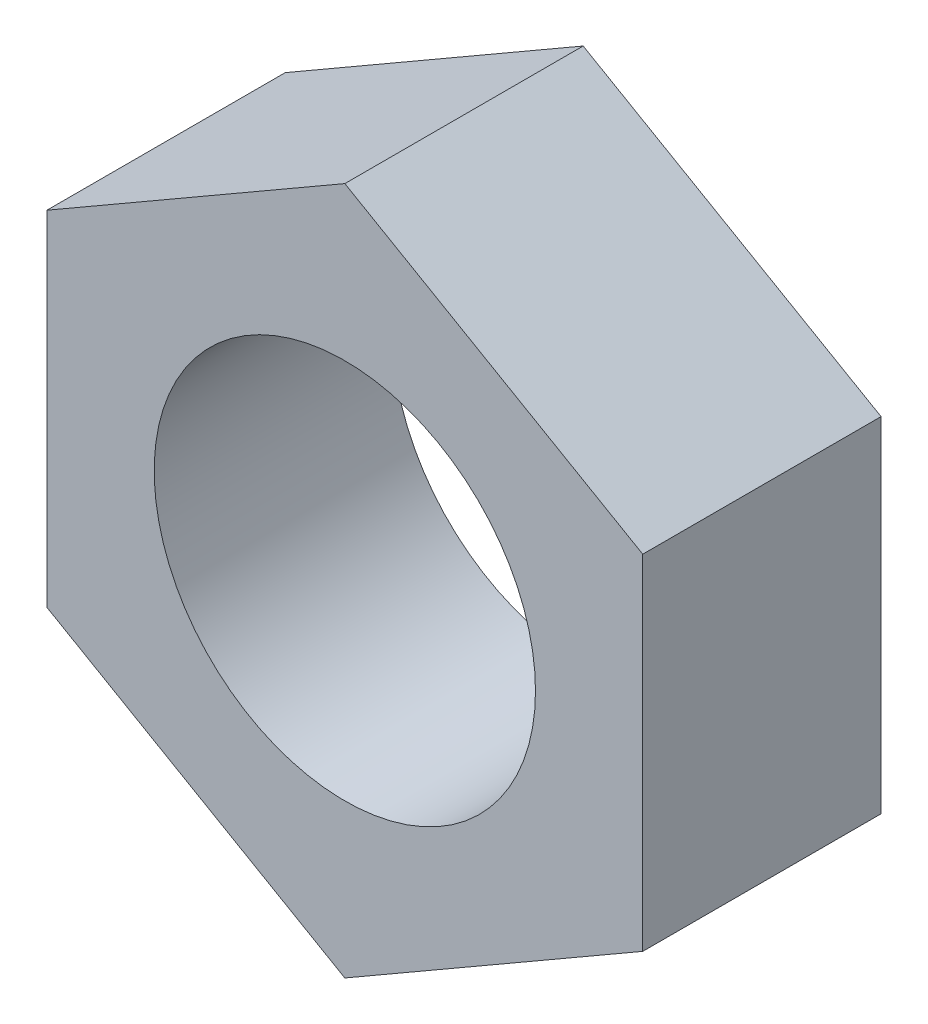
ISO-10303-21;
HEADER;
FILE_DESCRIPTION(('STEP AP214'),'2;1');
FILE_NAME('part.step','',(''),(''),'','','');
FILE_SCHEMA(('AUTOMOTIVE_DESIGN { 1 0 10303 214 1 1 1 1 }'));
ENDSEC;
DATA;
#1=APPLICATION_CONTEXT('core data for automotive mechanical design processes');
#2=APPLICATION_PROTOCOL_DEFINITION('international standard','automotive_design',2000,#1);
#3=PRODUCT_CONTEXT('',#1,'mechanical');
#4=PRODUCT('Part','Part','',(#3));
#5=PRODUCT_RELATED_PRODUCT_CATEGORY('part','',(#4));
#6=PRODUCT_DEFINITION_FORMATION('','',#4);
#7=PRODUCT_DEFINITION_CONTEXT('part definition',#1,'design');
#8=PRODUCT_DEFINITION('design','',#6,#7);
#9=PRODUCT_DEFINITION_SHAPE('','',#8);
#10=(LENGTH_UNIT() NAMED_UNIT(*) SI_UNIT(.MILLI.,.METRE.));
#11=(NAMED_UNIT(*) PLANE_ANGLE_UNIT() SI_UNIT($,.RADIAN.));
#12=(NAMED_UNIT(*) SI_UNIT($,.STERADIAN.) SOLID_ANGLE_UNIT());
#13=UNCERTAINTY_MEASURE_WITH_UNIT(LENGTH_MEASURE(1.E-05),#10,'distance_accuracy_value','');
#14=(GEOMETRIC_REPRESENTATION_CONTEXT(3) GLOBAL_UNCERTAINTY_ASSIGNED_CONTEXT((#13)) GLOBAL_UNIT_ASSIGNED_CONTEXT((#10,
#11,#12)) REPRESENTATION_CONTEXT('',''));
#15=CARTESIAN_POINT('',(0.,0.,0.));
#16=DIRECTION('',(0.,0.,1.));
#17=DIRECTION('',(1.,0.,0.));
#18=AXIS2_PLACEMENT_3D('',#15,#16,#17);
#19=CARTESIAN_POINT('',(11.90625,-13.7481532850779,4.7625));
#20=DIRECTION('',(0.499999999999998,0.86602540378444,0.));
#21=DIRECTION('',(-0.86602540378444,0.499999999999998,0.));
#22=AXIS2_PLACEMENT_3D('',#19,#20,#21);
#23=PLANE('',#22);
#24=DIRECTION('',(0.86602540378444,-0.499999999999998,0.));
#25=VECTOR('',#24,1.);
#26=CARTESIAN_POINT('',(11.90625,-13.7481532850779,-4.7625));
#27=LINE('',#26,#25);
#28=CARTESIAN_POINT('',(0.,-6.87407664253897,-4.7625));
#29=VERTEX_POINT('',#28);
#30=CARTESIAN_POINT('',(11.90625,-13.7481532850779,-4.7625));
#31=VERTEX_POINT('',#30);
#32=EDGE_CURVE('E119',#29,#31,#27,.T.);
#33=ORIENTED_EDGE('',*,*,#32,.T.);
#34=DIRECTION('',(0.,0.,-1.));
#35=VECTOR('',#34,1.);
#36=CARTESIAN_POINT('',(11.90625,-13.7481532850779,4.7625));
#37=LINE('',#36,#35);
#38=CARTESIAN_POINT('',(11.90625,-13.7481532850779,4.7625));
#39=VERTEX_POINT('',#38);
#40=EDGE_CURVE('E11',#39,#31,#37,.T.);
#41=ORIENTED_EDGE('',*,*,#40,.F.);
#42=DIRECTION('',(0.86602540378444,-0.499999999999998,0.));
#43=VECTOR('',#42,1.);
#44=CARTESIAN_POINT('',(11.90625,-13.7481532850779,4.7625));
#45=LINE('',#44,#43);
#46=CARTESIAN_POINT('',(0.,-6.87407664253897,4.7625));
#47=VERTEX_POINT('',#46);
#48=EDGE_CURVE('E130',#47,#39,#45,.T.);
#49=ORIENTED_EDGE('',*,*,#48,.F.);
#50=DIRECTION('',(0.,0.,-1.));
#51=VECTOR('',#50,1.);
#52=CARTESIAN_POINT('',(0.,-6.87407664253897,4.7625));
#53=LINE('',#52,#51);
#54=EDGE_CURVE('E115',#47,#29,#53,.T.);
#55=ORIENTED_EDGE('',*,*,#54,.T.);
#56=EDGE_LOOP('',(#33,#41,#49,#55));
#57=FACE_BOUND('',#56,.T.);
#58=ADVANCED_FACE('F35',(#57),#23,.F.);
#59=CARTESIAN_POINT('',(23.8125,-6.87407664253897,4.7625));
#60=DIRECTION('',(-0.499999999999998,0.86602540378444,0.));
#61=DIRECTION('',(-0.86602540378444,-0.499999999999998,0.));
#62=AXIS2_PLACEMENT_3D('',#59,#60,#61);
#63=PLANE('',#62);
#64=DIRECTION('',(0.86602540378444,0.499999999999998,0.));
#65=VECTOR('',#64,1.);
#66=CARTESIAN_POINT('',(23.8125,-6.87407664253897,-4.7625));
#67=LINE('',#66,#65);
#68=CARTESIAN_POINT('',(23.8125,-6.87407664253897,-4.7625));
#69=VERTEX_POINT('',#68);
#70=EDGE_CURVE('E122',#31,#69,#67,.T.);
#71=ORIENTED_EDGE('',*,*,#70,.T.);
#72=DIRECTION('',(0.,0.,-1.));
#73=VECTOR('',#72,1.);
#74=CARTESIAN_POINT('',(23.8125,-6.87407664253897,4.7625));
#75=LINE('',#74,#73);
#76=CARTESIAN_POINT('',(23.8125,-6.87407664253897,4.7625));
#77=VERTEX_POINT('',#76);
#78=EDGE_CURVE('E43',#77,#69,#75,.T.);
#79=ORIENTED_EDGE('',*,*,#78,.F.);
#80=DIRECTION('',(0.86602540378444,0.499999999999998,0.));
#81=VECTOR('',#80,1.);
#82=CARTESIAN_POINT('',(23.8125,-6.87407664253897,4.7625));
#83=LINE('',#82,#81);
#84=EDGE_CURVE('E88',#39,#77,#83,.T.);
#85=ORIENTED_EDGE('',*,*,#84,.F.);
#86=ORIENTED_EDGE('',*,*,#40,.T.);
#87=EDGE_LOOP('',(#71,#79,#85,#86));
#88=FACE_BOUND('',#87,.T.);
#89=ADVANCED_FACE('F155',(#88),#63,.F.);
#90=CARTESIAN_POINT('',(23.8125,6.87407664253897,4.7625));
#91=DIRECTION('',(-1.,0.,0.));
#92=DIRECTION('',(0.,0.,1.));
#93=AXIS2_PLACEMENT_3D('',#90,#91,#92);
#94=PLANE('',#93);
#95=DIRECTION('',(0.,1.,0.));
#96=VECTOR('',#95,1.);
#97=CARTESIAN_POINT('',(23.8125,6.87407664253897,-4.7625));
#98=LINE('',#97,#96);
#99=CARTESIAN_POINT('',(23.8125,6.87407664253897,-4.7625));
#100=VERTEX_POINT('',#99);
#101=EDGE_CURVE('E125',#69,#100,#98,.T.);
#102=ORIENTED_EDGE('',*,*,#101,.T.);
#103=DIRECTION('',(0.,0.,-1.));
#104=VECTOR('',#103,1.);
#105=CARTESIAN_POINT('',(23.8125,6.87407664253897,4.7625));
#106=LINE('',#105,#104);
#107=CARTESIAN_POINT('',(23.8125,6.87407664253897,4.7625));
#108=VERTEX_POINT('',#107);
#109=EDGE_CURVE('E110',#108,#100,#106,.T.);
#110=ORIENTED_EDGE('',*,*,#109,.F.);
#111=DIRECTION('',(0.,1.,0.));
#112=VECTOR('',#111,1.);
#113=CARTESIAN_POINT('',(23.8125,6.87407664253897,4.7625));
#114=LINE('',#113,#112);
#115=EDGE_CURVE('E101',#77,#108,#114,.T.);
#116=ORIENTED_EDGE('',*,*,#115,.F.);
#117=ORIENTED_EDGE('',*,*,#78,.T.);
#118=EDGE_LOOP('',(#102,#110,#116,#117));
#119=FACE_BOUND('',#118,.T.);
#120=ADVANCED_FACE('F136',(#119),#94,.F.);
#121=CARTESIAN_POINT('',(11.90625,13.7481532850779,4.7625));
#122=DIRECTION('',(-0.499999999999998,-0.86602540378444,0.));
#123=DIRECTION('',(0.86602540378444,-0.499999999999998,0.));
#124=AXIS2_PLACEMENT_3D('',#121,#122,#123);
#125=PLANE('',#124);
#126=DIRECTION('',(-0.86602540378444,0.499999999999998,0.));
#127=VECTOR('',#126,1.);
#128=CARTESIAN_POINT('',(11.90625,13.7481532850779,-4.7625));
#129=LINE('',#128,#127);
#130=CARTESIAN_POINT('',(11.90625,13.7481532850779,-4.7625));
#131=VERTEX_POINT('',#130);
#132=EDGE_CURVE('E109',#100,#131,#129,.T.);
#133=ORIENTED_EDGE('',*,*,#132,.T.);
#134=DIRECTION('',(0.,0.,-1.));
#135=VECTOR('',#134,1.);
#136=CARTESIAN_POINT('',(11.90625,13.7481532850779,4.7625));
#137=LINE('',#136,#135);
#138=CARTESIAN_POINT('',(11.90625,13.7481532850779,4.7625));
#139=VERTEX_POINT('',#138);
#140=EDGE_CURVE('E106',#139,#131,#137,.T.);
#141=ORIENTED_EDGE('',*,*,#140,.F.);
#142=DIRECTION('',(-0.86602540378444,0.499999999999998,0.));
#143=VECTOR('',#142,1.);
#144=CARTESIAN_POINT('',(11.90625,13.7481532850779,4.7625));
#145=LINE('',#144,#143);
#146=EDGE_CURVE('E95',#108,#139,#145,.T.);
#147=ORIENTED_EDGE('',*,*,#146,.F.);
#148=ORIENTED_EDGE('',*,*,#109,.T.);
#149=EDGE_LOOP('',(#133,#141,#147,#148));
#150=FACE_BOUND('',#149,.T.);
#151=ADVANCED_FACE('F107',(#150),#125,.F.);
#152=CARTESIAN_POINT('',(0.,6.87407664253897,4.7625));
#153=DIRECTION('',(0.499999999999998,-0.86602540378444,0.));
#154=DIRECTION('',(0.86602540378444,0.499999999999998,0.));
#155=AXIS2_PLACEMENT_3D('',#152,#153,#154);
#156=PLANE('',#155);
#157=DIRECTION('',(-0.86602540378444,-0.499999999999998,0.));
#158=VECTOR('',#157,1.);
#159=CARTESIAN_POINT('',(0.,6.87407664253897,-4.7625));
#160=LINE('',#159,#158);
#161=CARTESIAN_POINT('',(0.,6.87407664253897,-4.7625));
#162=VERTEX_POINT('',#161);
#163=EDGE_CURVE('E74',#131,#162,#160,.T.);
#164=ORIENTED_EDGE('',*,*,#163,.T.);
#165=DIRECTION('',(0.,0.,-1.));
#166=VECTOR('',#165,1.);
#167=CARTESIAN_POINT('',(0.,6.87407664253897,4.7625));
#168=LINE('',#167,#166);
#169=CARTESIAN_POINT('',(0.,6.87407664253897,4.7625));
#170=VERTEX_POINT('',#169);
#171=EDGE_CURVE('E111',#170,#162,#168,.T.);
#172=ORIENTED_EDGE('',*,*,#171,.F.);
#173=DIRECTION('',(-0.86602540378444,-0.499999999999998,0.));
#174=VECTOR('',#173,1.);
#175=CARTESIAN_POINT('',(0.,6.87407664253897,4.7625));
#176=LINE('',#175,#174);
#177=EDGE_CURVE('E99',#139,#170,#176,.T.);
#178=ORIENTED_EDGE('',*,*,#177,.F.);
#179=ORIENTED_EDGE('',*,*,#140,.T.);
#180=EDGE_LOOP('',(#164,#172,#178,#179));
#181=FACE_BOUND('',#180,.T.);
#182=ADVANCED_FACE('F113',(#181),#156,.F.);
#183=CARTESIAN_POINT('',(0.,-6.87407664253897,4.7625));
#184=DIRECTION('',(1.,0.,0.));
#185=DIRECTION('',(0.,1.,0.));
#186=AXIS2_PLACEMENT_3D('',#183,#184,#185);
#187=PLANE('',#186);
#188=DIRECTION('',(0.,-1.,0.));
#189=VECTOR('',#188,1.);
#190=CARTESIAN_POINT('',(0.,-6.87407664253897,-4.7625));
#191=LINE('',#190,#189);
#192=EDGE_CURVE('E80',#162,#29,#191,.T.);
#193=ORIENTED_EDGE('',*,*,#192,.T.);
#194=ORIENTED_EDGE('',*,*,#54,.F.);
#195=DIRECTION('',(0.,-1.,0.));
#196=VECTOR('',#195,1.);
#197=CARTESIAN_POINT('',(0.,-6.87407664253897,4.7625));
#198=LINE('',#197,#196);
#199=EDGE_CURVE('E51',#170,#47,#198,.T.);
#200=ORIENTED_EDGE('',*,*,#199,.F.);
#201=ORIENTED_EDGE('',*,*,#171,.T.);
#202=EDGE_LOOP('',(#193,#194,#200,#201));
#203=FACE_BOUND('',#202,.T.);
#204=ADVANCED_FACE('F143',(#203),#187,.F.);
#205=CARTESIAN_POINT('',(0.,0.,4.7625));
#206=DIRECTION('',(0.,0.,-1.));
#207=DIRECTION('',(-1.,0.,0.));
#208=AXIS2_PLACEMENT_3D('',#205,#206,#207);
#209=PLANE('',#208);
#210=CARTESIAN_POINT('',(11.90625,0.,4.7625));
#211=DIRECTION('',(0.,0.,1.));
#212=DIRECTION('',(1.,0.,0.));
#213=AXIS2_PLACEMENT_3D('',#210,#211,#212);
#214=CIRCLE('',#213,7.62);
#215=CARTESIAN_POINT('',(19.52625,0.,4.7625));
#216=VERTEX_POINT('',#215);
#217=EDGE_CURVE('E210',#216,#216,#214,.T.);
#218=ORIENTED_EDGE('',*,*,#217,.F.);
#219=EDGE_LOOP('',(#218));
#220=FACE_BOUND('',#219,.T.);
#221=ORIENTED_EDGE('',*,*,#48,.T.);
#222=ORIENTED_EDGE('',*,*,#84,.T.);
#223=ORIENTED_EDGE('',*,*,#115,.T.);
#224=ORIENTED_EDGE('',*,*,#146,.T.);
#225=ORIENTED_EDGE('',*,*,#177,.T.);
#226=ORIENTED_EDGE('',*,*,#199,.T.);
#227=EDGE_LOOP('',(#221,#222,#223,#224,#225,#226));
#228=FACE_BOUND('',#227,.T.);
#229=ADVANCED_FACE('F97',(#220,#228),#209,.F.);
#230=CARTESIAN_POINT('',(0.,0.,-4.7625));
#231=DIRECTION('',(0.,0.,-1.));
#232=DIRECTION('',(-1.,0.,0.));
#233=AXIS2_PLACEMENT_3D('',#230,#231,#232);
#234=PLANE('',#233);
#235=CARTESIAN_POINT('',(11.90625,0.,-4.7625));
#236=DIRECTION('',(0.,0.,1.));
#237=DIRECTION('',(1.,0.,0.));
#238=AXIS2_PLACEMENT_3D('',#235,#236,#237);
#239=CIRCLE('',#238,7.62);
#240=CARTESIAN_POINT('',(19.52625,0.,-4.7625));
#241=VERTEX_POINT('',#240);
#242=EDGE_CURVE('E123',#241,#241,#239,.T.);
#243=ORIENTED_EDGE('',*,*,#242,.T.);
#244=EDGE_LOOP('',(#243));
#245=FACE_BOUND('',#244,.T.);
#246=ORIENTED_EDGE('',*,*,#32,.F.);
#247=ORIENTED_EDGE('',*,*,#192,.F.);
#248=ORIENTED_EDGE('',*,*,#163,.F.);
#249=ORIENTED_EDGE('',*,*,#132,.F.);
#250=ORIENTED_EDGE('',*,*,#101,.F.);
#251=ORIENTED_EDGE('',*,*,#70,.F.);
#252=EDGE_LOOP('',(#246,#247,#248,#249,#250,#251));
#253=FACE_BOUND('',#252,.T.);
#254=ADVANCED_FACE('F139',(#245,#253),#234,.T.);
#255=CARTESIAN_POINT('',(11.90625,0.,-4.7625));
#256=DIRECTION('',(0.,0.,1.));
#257=DIRECTION('',(1.,0.,0.));
#258=AXIS2_PLACEMENT_3D('',#255,#256,#257);
#259=CYLINDRICAL_SURFACE('',#258,7.62);
#260=CARTESIAN_POINT('',(19.52625,0.,-4.7625));
#261=CARTESIAN_POINT('',(19.52625,0.,-4.66328125));
#262=CARTESIAN_POINT('',(19.52625,0.,-4.5640625));
#263=CARTESIAN_POINT('',(19.52625,0.,-4.365625));
#264=CARTESIAN_POINT('',(19.52625,0.,-4.26640625));
#265=CARTESIAN_POINT('',(19.52625,0.,-4.06796875));
#266=CARTESIAN_POINT('',(19.52625,0.,-3.96875));
#267=CARTESIAN_POINT('',(19.52625,0.,-3.7703125));
#268=CARTESIAN_POINT('',(19.52625,0.,-3.67109375));
#269=CARTESIAN_POINT('',(19.52625,0.,-3.47265625));
#270=CARTESIAN_POINT('',(19.52625,0.,-3.3734375));
#271=CARTESIAN_POINT('',(19.52625,0.,-3.175));
#272=CARTESIAN_POINT('',(19.52625,0.,-3.07578125));
#273=CARTESIAN_POINT('',(19.52625,0.,-2.87734375));
#274=CARTESIAN_POINT('',(19.52625,0.,-2.778125));
#275=CARTESIAN_POINT('',(19.52625,0.,-2.5796875));
#276=CARTESIAN_POINT('',(19.52625,0.,-2.48046875));
#277=CARTESIAN_POINT('',(19.52625,0.,-2.28203125));
#278=CARTESIAN_POINT('',(19.52625,0.,-2.1828125));
#279=CARTESIAN_POINT('',(19.52625,0.,-1.984375));
#280=CARTESIAN_POINT('',(19.52625,0.,-1.88515625));
#281=CARTESIAN_POINT('',(19.52625,0.,-1.68671875));
#282=CARTESIAN_POINT('',(19.52625,0.,-1.5875));
#283=CARTESIAN_POINT('',(19.52625,0.,-1.3890625));
#284=CARTESIAN_POINT('',(19.52625,0.,-1.28984375));
#285=CARTESIAN_POINT('',(19.52625,0.,-1.09140625));
#286=CARTESIAN_POINT('',(19.52625,0.,-0.9921875));
#287=CARTESIAN_POINT('',(19.52625,0.,-0.793750000000001));
#288=CARTESIAN_POINT('',(19.52625,0.,-0.694531250000001));
#289=CARTESIAN_POINT('',(19.52625,0.,-0.496093750000001));
#290=CARTESIAN_POINT('',(19.52625,0.,-0.396875000000001));
#291=CARTESIAN_POINT('',(19.52625,0.,-0.198437500000001));
#292=CARTESIAN_POINT('',(19.52625,0.,-0.0992187500000009));
#293=CARTESIAN_POINT('',(19.52625,0.,0.0992187499999992));
#294=CARTESIAN_POINT('',(19.52625,0.,0.198437499999999));
#295=CARTESIAN_POINT('',(19.52625,0.,0.396874999999999));
#296=CARTESIAN_POINT('',(19.52625,0.,0.496093749999999));
#297=CARTESIAN_POINT('',(19.52625,0.,0.694531249999999));
#298=CARTESIAN_POINT('',(19.52625,0.,0.79375));
#299=CARTESIAN_POINT('',(19.52625,0.,0.9921875));
#300=CARTESIAN_POINT('',(19.52625,0.,1.09140625));
#301=CARTESIAN_POINT('',(19.52625,0.,1.28984375));
#302=CARTESIAN_POINT('',(19.52625,0.,1.3890625));
#303=CARTESIAN_POINT('',(19.52625,0.,1.5875));
#304=CARTESIAN_POINT('',(19.52625,0.,1.68671875));
#305=CARTESIAN_POINT('',(19.52625,0.,1.88515625));
#306=CARTESIAN_POINT('',(19.52625,0.,1.984375));
#307=CARTESIAN_POINT('',(19.52625,0.,2.1828125));
#308=CARTESIAN_POINT('',(19.52625,0.,2.28203125));
#309=CARTESIAN_POINT('',(19.52625,0.,2.48046875));
#310=CARTESIAN_POINT('',(19.52625,0.,2.5796875));
#311=CARTESIAN_POINT('',(19.52625,0.,2.778125));
#312=CARTESIAN_POINT('',(19.52625,0.,2.87734375));
#313=CARTESIAN_POINT('',(19.52625,0.,3.07578125));
#314=CARTESIAN_POINT('',(19.52625,0.,3.175));
#315=CARTESIAN_POINT('',(19.52625,0.,3.3734375));
#316=CARTESIAN_POINT('',(19.52625,0.,3.47265625));
#317=CARTESIAN_POINT('',(19.52625,0.,3.67109375));
#318=CARTESIAN_POINT('',(19.52625,0.,3.7703125));
#319=CARTESIAN_POINT('',(19.52625,0.,3.96875));
#320=CARTESIAN_POINT('',(19.52625,0.,4.06796875));
#321=CARTESIAN_POINT('',(19.52625,0.,4.26640625));
#322=CARTESIAN_POINT('',(19.52625,0.,4.365625));
#323=CARTESIAN_POINT('',(19.52625,0.,4.5640625));
#324=CARTESIAN_POINT('',(19.52625,0.,4.66328125));
#325=CARTESIAN_POINT('',(19.52625,0.,4.7625));
#326=B_SPLINE_CURVE_WITH_KNOTS('',3,(#260,#261,#262,#263,#264,#265,#266,#267,#268,#269,#270,
#271,#272,#273,#274,#275,#276,#277,#278,#279,#280,#281,#282,#283,#284,#285,#286,#287,#288,#289,
#290,#291,#292,#293,#294,#295,#296,#297,#298,#299,#300,#301,#302,#303,#304,#305,#306,#307,#308,
#309,#310,#311,#312,#313,#314,#315,#316,#317,#318,#319,#320,#321,#322,#323,#324,#325),
.UNSPECIFIED.,.F.,.F.,(4,2,2,2,2,2,2,2,2,2,2,2,2,2,2,2,2,2,2,2,2,2,2,2,2,2,2,2,2,2,2,2,4),(0.,
0.29765625,0.5953125,0.892968750000001,1.190625,1.48828125,1.7859375,2.08359375,2.38125,
2.67890625,2.9765625,3.27421875,3.571875,3.86953125,4.1671875,4.46484375,4.7625,5.06015625,
5.3578125,5.65546875,5.953125,6.25078125,6.5484375,6.84609375,7.14375,7.44140625,7.7390625,
8.03671875,8.334375,8.63203125,8.9296875,9.22734375,9.525),.UNSPECIFIED.);
#327=EDGE_CURVE('BSEAM192',#241,#216,#326,.T.);
#328=ORIENTED_EDGE('',*,*,#242,.F.);
#329=ORIENTED_EDGE('',*,*,#217,.T.);
#330=ORIENTED_EDGE('',*,*,#327,.T.);
#331=ORIENTED_EDGE('',*,*,#327,.F.);
#332=EDGE_LOOP('',(#328,#330,#329,#331));
#333=FACE_BOUND('',#332,.T.);
#334=ADVANCED_FACE('F192',(#333),#259,.F.);
#335=CLOSED_SHELL('',(#58,#89,#120,#151,#182,#204,#229,#254,#334));
#336=MANIFOLD_SOLID_BREP('B2',#335);
#337=ADVANCED_BREP_SHAPE_REPRESENTATION('',(#18,#336),#14);
#338=SHAPE_DEFINITION_REPRESENTATION(#9,#337);
ENDSEC;
END-ISO-10303-21;
